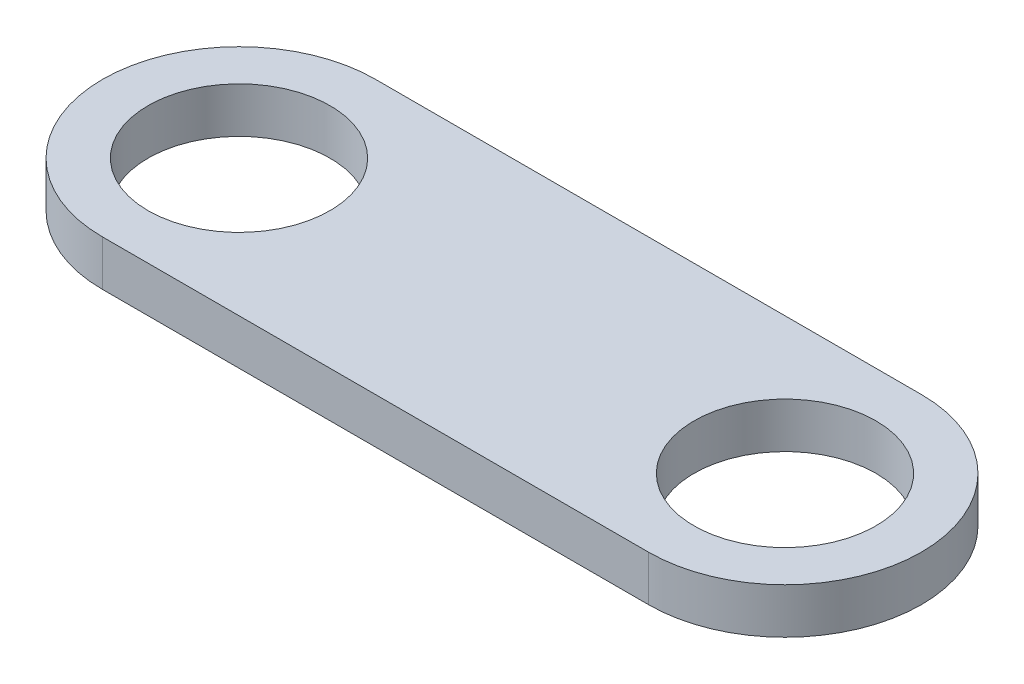
ISO-10303-21;
HEADER;
FILE_DESCRIPTION(('STEP AP214'),'2;1');
FILE_NAME('part.step','',(''),(''),'','','');
FILE_SCHEMA(('AUTOMOTIVE_DESIGN { 1 0 10303 214 1 1 1 1 }'));
ENDSEC;
DATA;
#1=APPLICATION_CONTEXT('core data for automotive mechanical design processes');
#2=APPLICATION_PROTOCOL_DEFINITION('international standard','automotive_design',2000,#1);
#3=PRODUCT_CONTEXT('',#1,'mechanical');
#4=PRODUCT('Part','Part','',(#3));
#5=PRODUCT_RELATED_PRODUCT_CATEGORY('part','',(#4));
#6=PRODUCT_DEFINITION_FORMATION('','',#4);
#7=PRODUCT_DEFINITION_CONTEXT('part definition',#1,'design');
#8=PRODUCT_DEFINITION('design','',#6,#7);
#9=PRODUCT_DEFINITION_SHAPE('','',#8);
#10=(LENGTH_UNIT() NAMED_UNIT(*) SI_UNIT(.MILLI.,.METRE.));
#11=(NAMED_UNIT(*) PLANE_ANGLE_UNIT() SI_UNIT($,.RADIAN.));
#12=(NAMED_UNIT(*) SI_UNIT($,.STERADIAN.) SOLID_ANGLE_UNIT());
#13=UNCERTAINTY_MEASURE_WITH_UNIT(LENGTH_MEASURE(1.E-05),#10,'distance_accuracy_value','');
#14=(GEOMETRIC_REPRESENTATION_CONTEXT(3) GLOBAL_UNCERTAINTY_ASSIGNED_CONTEXT((#13)) GLOBAL_UNIT_ASSIGNED_CONTEXT((#10,
#11,#12)) REPRESENTATION_CONTEXT('',''));
#15=CARTESIAN_POINT('',(0.,0.,0.));
#16=DIRECTION('',(0.,0.,1.));
#17=DIRECTION('',(1.,0.,0.));
#18=AXIS2_PLACEMENT_3D('',#15,#16,#17);
#19=CARTESIAN_POINT('',(-3.,0.5,0.));
#20=DIRECTION('',(0.,1.,0.));
#21=DIRECTION('',(0.,0.,1.));
#22=AXIS2_PLACEMENT_3D('',#19,#20,#21);
#23=PLANE('',#22);
#24=CARTESIAN_POINT('',(-3.,0.5,0.));
#25=DIRECTION('',(0.,1.,0.));
#26=DIRECTION('',(0.,0.,1.));
#27=AXIS2_PLACEMENT_3D('',#24,#25,#26);
#28=CIRCLE('',#27,1.);
#29=CARTESIAN_POINT('',(-3.,0.5,1.));
#30=VERTEX_POINT('',#29);
#31=EDGE_CURVE('E112',#30,#30,#28,.T.);
#32=ORIENTED_EDGE('',*,*,#31,.F.);
#33=EDGE_LOOP('',(#32));
#34=FACE_BOUND('',#33,.T.);
#35=CARTESIAN_POINT('',(-3.,0.5,0.));
#36=DIRECTION('',(0.,1.,0.));
#37=DIRECTION('',(0.,0.,1.));
#38=AXIS2_PLACEMENT_3D('',#35,#36,#37);
#39=CIRCLE('',#38,1.5);
#40=CARTESIAN_POINT('',(-3.,0.5,-1.5));
#41=VERTEX_POINT('',#40);
#42=CARTESIAN_POINT('',(-3.,0.5,1.5));
#43=VERTEX_POINT('',#42);
#44=EDGE_CURVE('E92',#41,#43,#39,.T.);
#45=ORIENTED_EDGE('',*,*,#44,.T.);
#46=DIRECTION('',(1.,0.,0.));
#47=VECTOR('',#46,1.);
#48=CARTESIAN_POINT('',(-3.,0.5,1.5));
#49=LINE('',#48,#47);
#50=CARTESIAN_POINT('',(3.,0.5,1.5));
#51=VERTEX_POINT('',#50);
#52=EDGE_CURVE('E87',#43,#51,#49,.T.);
#53=ORIENTED_EDGE('',*,*,#52,.T.);
#54=CARTESIAN_POINT('',(3.,0.5,0.));
#55=DIRECTION('',(0.,1.,0.));
#56=DIRECTION('',(0.,0.,-1.));
#57=AXIS2_PLACEMENT_3D('',#54,#55,#56);
#58=CIRCLE('',#57,1.5);
#59=CARTESIAN_POINT('',(3.,0.5,-1.5));
#60=VERTEX_POINT('',#59);
#61=EDGE_CURVE('E90',#51,#60,#58,.T.);
#62=ORIENTED_EDGE('',*,*,#61,.T.);
#63=DIRECTION('',(-1.,0.,0.));
#64=VECTOR('',#63,1.);
#65=CARTESIAN_POINT('',(-3.,0.5,-1.5));
#66=LINE('',#65,#64);
#67=EDGE_CURVE('E57',#60,#41,#66,.T.);
#68=ORIENTED_EDGE('',*,*,#67,.T.);
#69=EDGE_LOOP('',(#45,#53,#62,#68));
#70=FACE_BOUND('',#69,.T.);
#71=CARTESIAN_POINT('',(3.,0.5,0.));
#72=DIRECTION('',(0.,1.,0.));
#73=DIRECTION('',(0.,0.,-1.));
#74=AXIS2_PLACEMENT_3D('',#71,#72,#73);
#75=CIRCLE('',#74,1.);
#76=CARTESIAN_POINT('',(3.,0.5,-1.));
#77=VERTEX_POINT('',#76);
#78=EDGE_CURVE('E134',#77,#77,#75,.T.);
#79=ORIENTED_EDGE('',*,*,#78,.F.);
#80=EDGE_LOOP('',(#79));
#81=FACE_BOUND('',#80,.T.);
#82=ADVANCED_FACE('F39',(#34,#70,#81),#23,.T.);
#83=CARTESIAN_POINT('',(-3.,0.,0.));
#84=DIRECTION('',(0.,1.,0.));
#85=DIRECTION('',(0.,0.,1.));
#86=AXIS2_PLACEMENT_3D('',#83,#84,#85);
#87=PLANE('',#86);
#88=CARTESIAN_POINT('',(-3.,0.,0.));
#89=DIRECTION('',(0.,1.,0.));
#90=DIRECTION('',(0.,0.,1.));
#91=AXIS2_PLACEMENT_3D('',#88,#89,#90);
#92=CIRCLE('',#91,1.5);
#93=CARTESIAN_POINT('',(-3.,0.,-1.5));
#94=VERTEX_POINT('',#93);
#95=CARTESIAN_POINT('',(-3.,0.,1.5));
#96=VERTEX_POINT('',#95);
#97=EDGE_CURVE('E108',#94,#96,#92,.T.);
#98=ORIENTED_EDGE('',*,*,#97,.F.);
#99=DIRECTION('',(-1.,0.,0.));
#100=VECTOR('',#99,1.);
#101=CARTESIAN_POINT('',(-3.,0.,-1.5));
#102=LINE('',#101,#100);
#103=CARTESIAN_POINT('',(3.,0.,-1.5));
#104=VERTEX_POINT('',#103);
#105=EDGE_CURVE('E80',#104,#94,#102,.T.);
#106=ORIENTED_EDGE('',*,*,#105,.F.);
#107=CARTESIAN_POINT('',(3.,0.,0.));
#108=DIRECTION('',(0.,1.,0.));
#109=DIRECTION('',(0.,0.,-1.));
#110=AXIS2_PLACEMENT_3D('',#107,#108,#109);
#111=CIRCLE('',#110,1.5);
#112=CARTESIAN_POINT('',(3.,0.,1.5));
#113=VERTEX_POINT('',#112);
#114=EDGE_CURVE('E74',#113,#104,#111,.T.);
#115=ORIENTED_EDGE('',*,*,#114,.F.);
#116=DIRECTION('',(1.,0.,0.));
#117=VECTOR('',#116,1.);
#118=CARTESIAN_POINT('',(-3.,0.,1.5));
#119=LINE('',#118,#117);
#120=EDGE_CURVE('E97',#96,#113,#119,.T.);
#121=ORIENTED_EDGE('',*,*,#120,.F.);
#122=EDGE_LOOP('',(#98,#106,#115,#121));
#123=FACE_BOUND('',#122,.T.);
#124=CARTESIAN_POINT('',(-3.,0.,0.));
#125=DIRECTION('',(0.,1.,0.));
#126=DIRECTION('',(0.,0.,1.));
#127=AXIS2_PLACEMENT_3D('',#124,#125,#126);
#128=CIRCLE('',#127,1.);
#129=CARTESIAN_POINT('',(-3.,0.,1.));
#130=VERTEX_POINT('',#129);
#131=EDGE_CURVE('E130',#130,#130,#128,.T.);
#132=ORIENTED_EDGE('',*,*,#131,.T.);
#133=EDGE_LOOP('',(#132));
#134=FACE_BOUND('',#133,.T.);
#135=CARTESIAN_POINT('',(3.,0.,0.));
#136=DIRECTION('',(0.,1.,0.));
#137=DIRECTION('',(0.,0.,-1.));
#138=AXIS2_PLACEMENT_3D('',#135,#136,#137);
#139=CIRCLE('',#138,1.);
#140=CARTESIAN_POINT('',(3.,0.,-1.));
#141=VERTEX_POINT('',#140);
#142=EDGE_CURVE('E138',#141,#141,#139,.T.);
#143=ORIENTED_EDGE('',*,*,#142,.T.);
#144=EDGE_LOOP('',(#143));
#145=FACE_BOUND('',#144,.T.);
#146=ADVANCED_FACE('F125',(#123,#134,#145),#87,.F.);
#147=CARTESIAN_POINT('',(-3.,0.5,0.));
#148=DIRECTION('',(0.,-1.,0.));
#149=DIRECTION('',(0.,0.,-1.));
#150=AXIS2_PLACEMENT_3D('',#147,#148,#149);
#151=CYLINDRICAL_SURFACE('',#150,1.5);
#152=ORIENTED_EDGE('',*,*,#97,.T.);
#153=DIRECTION('',(0.,-1.,0.));
#154=VECTOR('',#153,1.);
#155=CARTESIAN_POINT('',(-3.,0.5,1.5));
#156=LINE('',#155,#154);
#157=EDGE_CURVE('E11',#43,#96,#156,.T.);
#158=ORIENTED_EDGE('',*,*,#157,.F.);
#159=ORIENTED_EDGE('',*,*,#44,.F.);
#160=DIRECTION('',(0.,-1.,0.));
#161=VECTOR('',#160,1.);
#162=CARTESIAN_POINT('',(-3.,0.5,-1.5));
#163=LINE('',#162,#161);
#164=EDGE_CURVE('E104',#41,#94,#163,.T.);
#165=ORIENTED_EDGE('',*,*,#164,.T.);
#166=EDGE_LOOP('',(#152,#158,#159,#165));
#167=FACE_BOUND('',#166,.T.);
#168=ADVANCED_FACE('F41',(#167),#151,.T.);
#169=CARTESIAN_POINT('',(-3.,0.5,1.5));
#170=DIRECTION('',(0.,0.,-1.));
#171=DIRECTION('',(-1.,0.,0.));
#172=AXIS2_PLACEMENT_3D('',#169,#170,#171);
#173=PLANE('',#172);
#174=ORIENTED_EDGE('',*,*,#120,.T.);
#175=DIRECTION('',(0.,-1.,0.));
#176=VECTOR('',#175,1.);
#177=CARTESIAN_POINT('',(3.,0.5,1.5));
#178=LINE('',#177,#176);
#179=EDGE_CURVE('E49',#51,#113,#178,.T.);
#180=ORIENTED_EDGE('',*,*,#179,.F.);
#181=ORIENTED_EDGE('',*,*,#52,.F.);
#182=ORIENTED_EDGE('',*,*,#157,.T.);
#183=EDGE_LOOP('',(#174,#180,#181,#182));
#184=FACE_BOUND('',#183,.T.);
#185=ADVANCED_FACE('F96',(#184),#173,.F.);
#186=CARTESIAN_POINT('',(3.,0.5,0.));
#187=DIRECTION('',(0.,-1.,0.));
#188=DIRECTION('',(0.,0.,-1.));
#189=AXIS2_PLACEMENT_3D('',#186,#187,#188);
#190=CYLINDRICAL_SURFACE('',#189,1.5);
#191=ORIENTED_EDGE('',*,*,#114,.T.);
#192=DIRECTION('',(0.,-1.,0.));
#193=VECTOR('',#192,1.);
#194=CARTESIAN_POINT('',(3.,0.5,-1.5));
#195=LINE('',#194,#193);
#196=EDGE_CURVE('E99',#60,#104,#195,.T.);
#197=ORIENTED_EDGE('',*,*,#196,.F.);
#198=ORIENTED_EDGE('',*,*,#61,.F.);
#199=ORIENTED_EDGE('',*,*,#179,.T.);
#200=EDGE_LOOP('',(#191,#197,#198,#199));
#201=FACE_BOUND('',#200,.T.);
#202=ADVANCED_FACE('F100',(#201),#190,.T.);
#203=CARTESIAN_POINT('',(-3.,0.5,-1.5));
#204=DIRECTION('',(0.,0.,1.));
#205=DIRECTION('',(1.,0.,0.));
#206=AXIS2_PLACEMENT_3D('',#203,#204,#205);
#207=PLANE('',#206);
#208=ORIENTED_EDGE('',*,*,#105,.T.);
#209=ORIENTED_EDGE('',*,*,#164,.F.);
#210=ORIENTED_EDGE('',*,*,#67,.F.);
#211=ORIENTED_EDGE('',*,*,#196,.T.);
#212=EDGE_LOOP('',(#208,#209,#210,#211));
#213=FACE_BOUND('',#212,.T.);
#214=ADVANCED_FACE('F122',(#213),#207,.F.);
#215=CARTESIAN_POINT('',(-3.,0.5,0.));
#216=DIRECTION('',(0.,-1.,0.));
#217=DIRECTION('',(0.,0.,-1.));
#218=AXIS2_PLACEMENT_3D('',#215,#216,#217);
#219=CYLINDRICAL_SURFACE('',#218,1.);
#220=ORIENTED_EDGE('',*,*,#31,.T.);
#221=EDGE_LOOP('',(#220));
#222=FACE_BOUND('',#221,.T.);
#223=ORIENTED_EDGE('',*,*,#131,.F.);
#224=EDGE_LOOP('',(#223));
#225=FACE_BOUND('',#224,.T.);
#226=ADVANCED_FACE('F157',(#222,#225),#219,.F.);
#227=CARTESIAN_POINT('',(3.,0.5,0.));
#228=DIRECTION('',(0.,-1.,0.));
#229=DIRECTION('',(0.,0.,-1.));
#230=AXIS2_PLACEMENT_3D('',#227,#228,#229);
#231=CYLINDRICAL_SURFACE('',#230,1.);
#232=ORIENTED_EDGE('',*,*,#78,.T.);
#233=EDGE_LOOP('',(#232));
#234=FACE_BOUND('',#233,.T.);
#235=ORIENTED_EDGE('',*,*,#142,.F.);
#236=EDGE_LOOP('',(#235));
#237=FACE_BOUND('',#236,.T.);
#238=ADVANCED_FACE('F146',(#234,#237),#231,.F.);
#239=CLOSED_SHELL('',(#82,#146,#168,#185,#202,#214,#226,#238));
#240=MANIFOLD_SOLID_BREP('B2',#239);
#241=ADVANCED_BREP_SHAPE_REPRESENTATION('',(#18,#240),#14);
#242=SHAPE_DEFINITION_REPRESENTATION(#9,#241);
ENDSEC;
END-ISO-10303-21;
